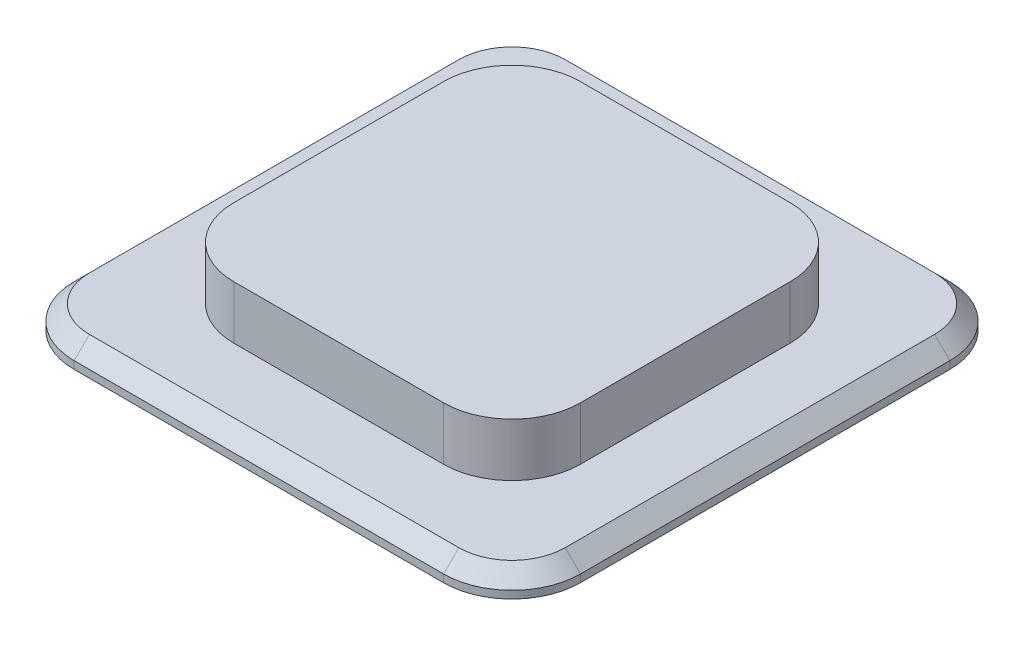
ISO-10303-21;
HEADER;
FILE_DESCRIPTION(('STEP AP214'),'2;1');
FILE_NAME('part.step','',(''),(''),'','','');
FILE_SCHEMA(('AUTOMOTIVE_DESIGN { 1 0 10303 214 1 1 1 1 }'));
ENDSEC;
DATA;
#1=APPLICATION_CONTEXT('core data for automotive mechanical design processes');
#2=APPLICATION_PROTOCOL_DEFINITION('international standard','automotive_design',2000,#1);
#3=PRODUCT_CONTEXT('',#1,'mechanical');
#4=PRODUCT('Part','Part','',(#3));
#5=PRODUCT_RELATED_PRODUCT_CATEGORY('part','',(#4));
#6=PRODUCT_DEFINITION_FORMATION('','',#4);
#7=PRODUCT_DEFINITION_CONTEXT('part definition',#1,'design');
#8=PRODUCT_DEFINITION('design','',#6,#7);
#9=PRODUCT_DEFINITION_SHAPE('','',#8);
#10=(LENGTH_UNIT() NAMED_UNIT(*) SI_UNIT(.MILLI.,.METRE.));
#11=(NAMED_UNIT(*) PLANE_ANGLE_UNIT() SI_UNIT($,.RADIAN.));
#12=(NAMED_UNIT(*) SI_UNIT($,.STERADIAN.) SOLID_ANGLE_UNIT());
#13=UNCERTAINTY_MEASURE_WITH_UNIT(LENGTH_MEASURE(1.E-05),#10,'distance_accuracy_value','');
#14=(GEOMETRIC_REPRESENTATION_CONTEXT(3) GLOBAL_UNCERTAINTY_ASSIGNED_CONTEXT((#13)) GLOBAL_UNIT_ASSIGNED_CONTEXT((#10,
#11,#12)) REPRESENTATION_CONTEXT('',''));
#15=CARTESIAN_POINT('',(0.,0.,0.));
#16=DIRECTION('',(0.,0.,1.));
#17=DIRECTION('',(1.,0.,0.));
#18=AXIS2_PLACEMENT_3D('',#15,#16,#17);
#19=CARTESIAN_POINT('',(0.,1.5,0.));
#20=DIRECTION('',(0.,1.,0.));
#21=DIRECTION('',(0.,0.,1.));
#22=AXIS2_PLACEMENT_3D('',#19,#20,#21);
#23=PLANE('',#22);
#24=DIRECTION('',(0.,0.,-1.));
#25=VECTOR('',#24,1.);
#26=CARTESIAN_POINT('',(15.65,1.5,-12.15));
#27=LINE('',#26,#25);
#28=CARTESIAN_POINT('',(15.65,1.5,12.15));
#29=VERTEX_POINT('',#28);
#30=CARTESIAN_POINT('',(15.65,1.5,-12.15));
#31=VERTEX_POINT('',#30);
#32=EDGE_CURVE('E279',#29,#31,#27,.T.);
#33=ORIENTED_EDGE('',*,*,#32,.T.);
#34=CARTESIAN_POINT('',(12.15,1.5,-12.15));
#35=DIRECTION('',(0.,1.,0.));
#36=DIRECTION('',(0.,0.,1.));
#37=AXIS2_PLACEMENT_3D('',#34,#35,#36);
#38=CIRCLE('',#37,3.49999999999999);
#39=CARTESIAN_POINT('',(12.15,1.5,-15.65));
#40=VERTEX_POINT('',#39);
#41=EDGE_CURVE('E281',#31,#40,#38,.T.);
#42=ORIENTED_EDGE('',*,*,#41,.T.);
#43=DIRECTION('',(-1.,0.,0.));
#44=VECTOR('',#43,1.);
#45=CARTESIAN_POINT('',(0.,1.5,-15.65));
#46=LINE('',#45,#44);
#47=CARTESIAN_POINT('',(-12.15,1.5,-15.65));
#48=VERTEX_POINT('',#47);
#49=EDGE_CURVE('E267',#40,#48,#46,.T.);
#50=ORIENTED_EDGE('',*,*,#49,.T.);
#51=CARTESIAN_POINT('',(-12.15,1.5,-12.15));
#52=DIRECTION('',(0.,1.,0.));
#53=DIRECTION('',(0.,0.,1.));
#54=AXIS2_PLACEMENT_3D('',#51,#52,#53);
#55=CIRCLE('',#54,3.49999999999999);
#56=CARTESIAN_POINT('',(-15.65,1.5,-12.15));
#57=VERTEX_POINT('',#56);
#58=EDGE_CURVE('E269',#48,#57,#55,.T.);
#59=ORIENTED_EDGE('',*,*,#58,.T.);
#60=DIRECTION('',(0.,0.,1.));
#61=VECTOR('',#60,1.);
#62=CARTESIAN_POINT('',(-15.65,1.5,0.));
#63=LINE('',#62,#61);
#64=CARTESIAN_POINT('',(-15.65,1.5,12.15));
#65=VERTEX_POINT('',#64);
#66=EDGE_CURVE('E271',#57,#65,#63,.T.);
#67=ORIENTED_EDGE('',*,*,#66,.T.);
#68=CARTESIAN_POINT('',(-12.15,1.5,12.15));
#69=DIRECTION('',(0.,1.,0.));
#70=DIRECTION('',(0.,0.,1.));
#71=AXIS2_PLACEMENT_3D('',#68,#69,#70);
#72=CIRCLE('',#71,3.49999999999999);
#73=CARTESIAN_POINT('',(-12.15,1.5,15.65));
#74=VERTEX_POINT('',#73);
#75=EDGE_CURVE('E273',#65,#74,#72,.T.);
#76=ORIENTED_EDGE('',*,*,#75,.T.);
#77=DIRECTION('',(1.,0.,0.));
#78=VECTOR('',#77,1.);
#79=CARTESIAN_POINT('',(12.15,1.5,15.65));
#80=LINE('',#79,#78);
#81=CARTESIAN_POINT('',(12.15,1.5,15.65));
#82=VERTEX_POINT('',#81);
#83=EDGE_CURVE('E275',#74,#82,#80,.T.);
#84=ORIENTED_EDGE('',*,*,#83,.T.);
#85=CARTESIAN_POINT('',(12.15,1.5,12.15));
#86=DIRECTION('',(0.,1.,0.));
#87=DIRECTION('',(0.,0.,1.));
#88=AXIS2_PLACEMENT_3D('',#85,#86,#87);
#89=CIRCLE('',#88,3.49999999999999);
#90=EDGE_CURVE('E277',#82,#29,#89,.T.);
#91=ORIENTED_EDGE('',*,*,#90,.T.);
#92=EDGE_LOOP('',(#33,#42,#50,#59,#67,#76,#84,#91));
#93=FACE_BOUND('',#92,.T.);
#94=DIRECTION('',(-1.,0.,0.));
#95=VECTOR('',#94,1.);
#96=CARTESIAN_POINT('',(0.,1.5,-11.4));
#97=LINE('',#96,#95);
#98=CARTESIAN_POINT('',(6.9,1.5,-11.4));
#99=VERTEX_POINT('',#98);
#100=CARTESIAN_POINT('',(-6.9,1.5,-11.4));
#101=VERTEX_POINT('',#100);
#102=EDGE_CURVE('E340',#99,#101,#97,.T.);
#103=ORIENTED_EDGE('',*,*,#102,.F.);
#104=CARTESIAN_POINT('',(6.9,1.5,-6.9));
#105=DIRECTION('',(0.,1.,0.));
#106=DIRECTION('',(0.,0.,1.));
#107=AXIS2_PLACEMENT_3D('',#104,#105,#106);
#108=CIRCLE('',#107,4.5);
#109=CARTESIAN_POINT('',(11.4,1.5,-6.9));
#110=VERTEX_POINT('',#109);
#111=EDGE_CURVE('E261',#99,#110,#108,.F.);
#112=ORIENTED_EDGE('',*,*,#111,.T.);
#113=DIRECTION('',(0.,0.,1.));
#114=VECTOR('',#113,1.);
#115=CARTESIAN_POINT('',(11.4,1.5,0.));
#116=LINE('',#115,#114);
#117=CARTESIAN_POINT('',(11.4,1.5,6.9));
#118=VERTEX_POINT('',#117);
#119=EDGE_CURVE('E343',#110,#118,#116,.T.);
#120=ORIENTED_EDGE('',*,*,#119,.T.);
#121=CARTESIAN_POINT('',(6.9,1.5,6.9));
#122=DIRECTION('',(0.,1.,0.));
#123=DIRECTION('',(0.,0.,1.));
#124=AXIS2_PLACEMENT_3D('',#121,#122,#123);
#125=CIRCLE('',#124,4.5);
#126=CARTESIAN_POINT('',(6.9,1.5,11.4));
#127=VERTEX_POINT('',#126);
#128=EDGE_CURVE('E259',#118,#127,#125,.F.);
#129=ORIENTED_EDGE('',*,*,#128,.T.);
#130=DIRECTION('',(-1.,0.,0.));
#131=VECTOR('',#130,1.);
#132=CARTESIAN_POINT('',(0.,1.5,11.4));
#133=LINE('',#132,#131);
#134=CARTESIAN_POINT('',(-6.9,1.5,11.4));
#135=VERTEX_POINT('',#134);
#136=EDGE_CURVE('E210',#127,#135,#133,.T.);
#137=ORIENTED_EDGE('',*,*,#136,.T.);
#138=CARTESIAN_POINT('',(-6.9,1.5,6.9));
#139=DIRECTION('',(0.,1.,0.));
#140=DIRECTION('',(0.,0.,1.));
#141=AXIS2_PLACEMENT_3D('',#138,#139,#140);
#142=CIRCLE('',#141,4.5);
#143=CARTESIAN_POINT('',(-11.4,1.5,6.9));
#144=VERTEX_POINT('',#143);
#145=EDGE_CURVE('E265',#135,#144,#142,.F.);
#146=ORIENTED_EDGE('',*,*,#145,.T.);
#147=DIRECTION('',(0.,0.,1.));
#148=VECTOR('',#147,1.);
#149=CARTESIAN_POINT('',(-11.4,1.5,0.));
#150=LINE('',#149,#148);
#151=CARTESIAN_POINT('',(-11.4,1.5,-6.9));
#152=VERTEX_POINT('',#151);
#153=EDGE_CURVE('E337',#152,#144,#150,.T.);
#154=ORIENTED_EDGE('',*,*,#153,.F.);
#155=CARTESIAN_POINT('',(-6.9,1.5,-6.9));
#156=DIRECTION('',(0.,1.,0.));
#157=DIRECTION('',(0.,0.,1.));
#158=AXIS2_PLACEMENT_3D('',#155,#156,#157);
#159=CIRCLE('',#158,4.5);
#160=EDGE_CURVE('E263',#152,#101,#159,.F.);
#161=ORIENTED_EDGE('',*,*,#160,.T.);
#162=EDGE_LOOP('',(#103,#112,#120,#129,#137,#146,#154,#161));
#163=FACE_BOUND('',#162,.T.);
#164=ADVANCED_FACE('F37',(#93,#163),#23,.T.);
#165=CARTESIAN_POINT('',(0.,1.5,16.65));
#166=DIRECTION('',(0.,0.,-1.));
#167=DIRECTION('',(-1.,0.,0.));
#168=AXIS2_PLACEMENT_3D('',#165,#166,#167);
#169=PLANE('',#168);
#170=DIRECTION('',(0.,-1.,0.));
#171=VECTOR('',#170,1.);
#172=CARTESIAN_POINT('',(12.15,1.5,16.65));
#173=LINE('',#172,#171);
#174=CARTESIAN_POINT('',(12.15,0.,16.65));
#175=VERTEX_POINT('',#174);
#176=CARTESIAN_POINT('',(12.15,0.499999999999992,16.65));
#177=VERTEX_POINT('',#176);
#178=EDGE_CURVE('E195',#175,#177,#173,.F.);
#179=ORIENTED_EDGE('',*,*,#178,.T.);
#180=DIRECTION('',(-1.,0.,0.));
#181=VECTOR('',#180,1.);
#182=CARTESIAN_POINT('',(-12.15,0.499999999999992,16.65));
#183=LINE('',#182,#181);
#184=CARTESIAN_POINT('',(-12.15,0.499999999999992,16.65));
#185=VERTEX_POINT('',#184);
#186=EDGE_CURVE('E290',#177,#185,#183,.T.);
#187=ORIENTED_EDGE('',*,*,#186,.T.);
#188=DIRECTION('',(0.,-1.,0.));
#189=VECTOR('',#188,1.);
#190=CARTESIAN_POINT('',(-12.15,0.,16.65));
#191=LINE('',#190,#189);
#192=CARTESIAN_POINT('',(-12.15,0.,16.65));
#193=VERTEX_POINT('',#192);
#194=EDGE_CURVE('E199',#185,#193,#191,.T.);
#195=ORIENTED_EDGE('',*,*,#194,.T.);
#196=DIRECTION('',(1.,0.,0.));
#197=VECTOR('',#196,1.);
#198=CARTESIAN_POINT('',(0.,0.,16.65));
#199=LINE('',#198,#197);
#200=EDGE_CURVE('E206',#193,#175,#199,.T.);
#201=ORIENTED_EDGE('',*,*,#200,.T.);
#202=EDGE_LOOP('',(#179,#187,#195,#201));
#203=FACE_BOUND('',#202,.T.);
#204=ADVANCED_FACE('F394',(#203),#169,.F.);
#205=CARTESIAN_POINT('',(16.65,1.5,0.));
#206=DIRECTION('',(-1.,0.,0.));
#207=DIRECTION('',(0.,0.,1.));
#208=AXIS2_PLACEMENT_3D('',#205,#206,#207);
#209=PLANE('',#208);
#210=DIRECTION('',(0.,-1.,0.));
#211=VECTOR('',#210,1.);
#212=CARTESIAN_POINT('',(16.65,1.5,-12.15));
#213=LINE('',#212,#211);
#214=CARTESIAN_POINT('',(16.65,0.,-12.15));
#215=VERTEX_POINT('',#214);
#216=CARTESIAN_POINT('',(16.65,0.499999999999992,-12.15));
#217=VERTEX_POINT('',#216);
#218=EDGE_CURVE('E189',#215,#217,#213,.F.);
#219=ORIENTED_EDGE('',*,*,#218,.T.);
#220=DIRECTION('',(0.,0.,1.));
#221=VECTOR('',#220,1.);
#222=CARTESIAN_POINT('',(16.65,0.499999999999992,12.15));
#223=LINE('',#222,#221);
#224=CARTESIAN_POINT('',(16.65,0.499999999999992,12.15));
#225=VERTEX_POINT('',#224);
#226=EDGE_CURVE('E185',#217,#225,#223,.T.);
#227=ORIENTED_EDGE('',*,*,#226,.T.);
#228=DIRECTION('',(0.,-1.,0.));
#229=VECTOR('',#228,1.);
#230=CARTESIAN_POINT('',(16.65,1.5,12.15));
#231=LINE('',#230,#229);
#232=CARTESIAN_POINT('',(16.65,0.,12.15));
#233=VERTEX_POINT('',#232);
#234=EDGE_CURVE('E177',#225,#233,#231,.T.);
#235=ORIENTED_EDGE('',*,*,#234,.T.);
#236=DIRECTION('',(0.,0.,-1.));
#237=VECTOR('',#236,1.);
#238=CARTESIAN_POINT('',(16.65,0.,0.));
#239=LINE('',#238,#237);
#240=EDGE_CURVE('E182',#233,#215,#239,.T.);
#241=ORIENTED_EDGE('',*,*,#240,.T.);
#242=EDGE_LOOP('',(#219,#227,#235,#241));
#243=FACE_BOUND('',#242,.T.);
#244=ADVANCED_FACE('F180',(#243),#209,.F.);
#245=CARTESIAN_POINT('',(0.,1.5,-16.65));
#246=DIRECTION('',(0.,0.,-1.));
#247=DIRECTION('',(-1.,0.,0.));
#248=AXIS2_PLACEMENT_3D('',#245,#246,#247);
#249=PLANE('',#248);
#250=DIRECTION('',(0.,-1.,0.));
#251=VECTOR('',#250,1.);
#252=CARTESIAN_POINT('',(-12.15,1.5,-16.65));
#253=LINE('',#252,#251);
#254=CARTESIAN_POINT('',(-12.15,0.,-16.65));
#255=VERTEX_POINT('',#254);
#256=CARTESIAN_POINT('',(-12.15,0.499999999999992,-16.65));
#257=VERTEX_POINT('',#256);
#258=EDGE_CURVE('E246',#255,#257,#253,.F.);
#259=ORIENTED_EDGE('',*,*,#258,.T.);
#260=DIRECTION('',(1.,0.,0.));
#261=VECTOR('',#260,1.);
#262=CARTESIAN_POINT('',(0.,0.499999999999992,-16.65));
#263=LINE('',#262,#261);
#264=CARTESIAN_POINT('',(12.15,0.499999999999992,-16.65));
#265=VERTEX_POINT('',#264);
#266=EDGE_CURVE('E11',#257,#265,#263,.T.);
#267=ORIENTED_EDGE('',*,*,#266,.T.);
#268=DIRECTION('',(0.,-1.,0.));
#269=VECTOR('',#268,1.);
#270=CARTESIAN_POINT('',(12.15,0.,-16.65));
#271=LINE('',#270,#269);
#272=CARTESIAN_POINT('',(12.15,0.,-16.65));
#273=VERTEX_POINT('',#272);
#274=EDGE_CURVE('E248',#265,#273,#271,.T.);
#275=ORIENTED_EDGE('',*,*,#274,.T.);
#276=DIRECTION('',(1.,0.,0.));
#277=VECTOR('',#276,1.);
#278=CARTESIAN_POINT('',(0.,0.,-16.65));
#279=LINE('',#278,#277);
#280=EDGE_CURVE('E205',#255,#273,#279,.T.);
#281=ORIENTED_EDGE('',*,*,#280,.F.);
#282=EDGE_LOOP('',(#259,#267,#275,#281));
#283=FACE_BOUND('',#282,.T.);
#284=ADVANCED_FACE('F410',(#283),#249,.T.);
#285=CARTESIAN_POINT('',(-16.65,1.5,0.));
#286=DIRECTION('',(-1.,0.,0.));
#287=DIRECTION('',(0.,0.,1.));
#288=AXIS2_PLACEMENT_3D('',#285,#286,#287);
#289=PLANE('',#288);
#290=DIRECTION('',(0.,-1.,0.));
#291=VECTOR('',#290,1.);
#292=CARTESIAN_POINT('',(-16.65,1.5,12.15));
#293=LINE('',#292,#291);
#294=CARTESIAN_POINT('',(-16.65,0.,12.15));
#295=VERTEX_POINT('',#294);
#296=CARTESIAN_POINT('',(-16.65,0.499999999999992,12.15));
#297=VERTEX_POINT('',#296);
#298=EDGE_CURVE('E250',#295,#297,#293,.F.);
#299=ORIENTED_EDGE('',*,*,#298,.T.);
#300=DIRECTION('',(0.,0.,-1.));
#301=VECTOR('',#300,1.);
#302=CARTESIAN_POINT('',(-16.65,0.499999999999992,0.));
#303=LINE('',#302,#301);
#304=CARTESIAN_POINT('',(-16.65,0.499999999999992,-12.15));
#305=VERTEX_POINT('',#304);
#306=EDGE_CURVE('E62',#297,#305,#303,.T.);
#307=ORIENTED_EDGE('',*,*,#306,.T.);
#308=DIRECTION('',(0.,-1.,0.));
#309=VECTOR('',#308,1.);
#310=CARTESIAN_POINT('',(-16.65,1.5,-12.15));
#311=LINE('',#310,#309);
#312=CARTESIAN_POINT('',(-16.65,0.,-12.15));
#313=VERTEX_POINT('',#312);
#314=EDGE_CURVE('E252',#305,#313,#311,.T.);
#315=ORIENTED_EDGE('',*,*,#314,.T.);
#316=DIRECTION('',(0.,0.,-1.));
#317=VECTOR('',#316,1.);
#318=CARTESIAN_POINT('',(-16.65,0.,0.));
#319=LINE('',#318,#317);
#320=EDGE_CURVE('E208',#295,#313,#319,.T.);
#321=ORIENTED_EDGE('',*,*,#320,.F.);
#322=EDGE_LOOP('',(#299,#307,#315,#321));
#323=FACE_BOUND('',#322,.T.);
#324=ADVANCED_FACE('F407',(#323),#289,.T.);
#325=CARTESIAN_POINT('',(0.,0.,0.));
#326=DIRECTION('',(0.,1.,0.));
#327=DIRECTION('',(0.,0.,1.));
#328=AXIS2_PLACEMENT_3D('',#325,#326,#327);
#329=PLANE('',#328);
#330=ORIENTED_EDGE('',*,*,#240,.F.);
#331=CARTESIAN_POINT('',(12.15,0.,12.15));
#332=DIRECTION('',(0.,1.,0.));
#333=DIRECTION('',(0.,0.,1.));
#334=AXIS2_PLACEMENT_3D('',#331,#332,#333);
#335=CIRCLE('',#334,4.5);
#336=EDGE_CURVE('E192',#233,#175,#335,.F.);
#337=ORIENTED_EDGE('',*,*,#336,.T.);
#338=ORIENTED_EDGE('',*,*,#200,.F.);
#339=CARTESIAN_POINT('',(-12.15,0.,12.15));
#340=DIRECTION('',(0.,1.,0.));
#341=DIRECTION('',(0.,0.,1.));
#342=AXIS2_PLACEMENT_3D('',#339,#340,#341);
#343=CIRCLE('',#342,4.5);
#344=EDGE_CURVE('E188',#193,#295,#343,.F.);
#345=ORIENTED_EDGE('',*,*,#344,.T.);
#346=ORIENTED_EDGE('',*,*,#320,.T.);
#347=CARTESIAN_POINT('',(-12.15,0.,-12.15));
#348=DIRECTION('',(0.,1.,0.));
#349=DIRECTION('',(0.,0.,1.));
#350=AXIS2_PLACEMENT_3D('',#347,#348,#349);
#351=CIRCLE('',#350,4.5);
#352=EDGE_CURVE('E218',#313,#255,#351,.F.);
#353=ORIENTED_EDGE('',*,*,#352,.T.);
#354=ORIENTED_EDGE('',*,*,#280,.T.);
#355=CARTESIAN_POINT('',(12.15,0.,-12.15));
#356=DIRECTION('',(0.,1.,0.));
#357=DIRECTION('',(0.,0.,1.));
#358=AXIS2_PLACEMENT_3D('',#355,#356,#357);
#359=CIRCLE('',#358,4.5);
#360=EDGE_CURVE('E200',#273,#215,#359,.F.);
#361=ORIENTED_EDGE('',*,*,#360,.T.);
#362=EDGE_LOOP('',(#330,#337,#338,#345,#346,#353,#354,#361));
#363=FACE_BOUND('',#362,.T.);
#364=ADVANCED_FACE('F202',(#363),#329,.F.);
#365=CARTESIAN_POINT('',(0.,5.,11.4));
#366=DIRECTION('',(0.,0.,-1.));
#367=DIRECTION('',(-1.,0.,0.));
#368=AXIS2_PLACEMENT_3D('',#365,#366,#367);
#369=PLANE('',#368);
#370=ORIENTED_EDGE('',*,*,#136,.F.);
#371=DIRECTION('',(0.,-1.,0.));
#372=VECTOR('',#371,1.);
#373=CARTESIAN_POINT('',(6.9,5.,11.4));
#374=LINE('',#373,#372);
#375=CARTESIAN_POINT('',(6.9,5.,11.4));
#376=VERTEX_POINT('',#375);
#377=EDGE_CURVE('E231',#127,#376,#374,.F.);
#378=ORIENTED_EDGE('',*,*,#377,.T.);
#379=DIRECTION('',(1.,0.,0.));
#380=VECTOR('',#379,1.);
#381=CARTESIAN_POINT('',(0.,5.,11.4));
#382=LINE('',#381,#380);
#383=CARTESIAN_POINT('',(-6.9,5.,11.4));
#384=VERTEX_POINT('',#383);
#385=EDGE_CURVE('E317',#384,#376,#382,.T.);
#386=ORIENTED_EDGE('',*,*,#385,.F.);
#387=DIRECTION('',(0.,-1.,0.));
#388=VECTOR('',#387,1.);
#389=CARTESIAN_POINT('',(-6.9,1.5,11.4));
#390=LINE('',#389,#388);
#391=EDGE_CURVE('E228',#384,#135,#390,.T.);
#392=ORIENTED_EDGE('',*,*,#391,.T.);
#393=EDGE_LOOP('',(#370,#378,#386,#392));
#394=FACE_BOUND('',#393,.T.);
#395=ADVANCED_FACE('F352',(#394),#369,.F.);
#396=CARTESIAN_POINT('',(11.4,5.,0.));
#397=DIRECTION('',(-1.,0.,0.));
#398=DIRECTION('',(0.,0.,1.));
#399=AXIS2_PLACEMENT_3D('',#396,#397,#398);
#400=PLANE('',#399);
#401=DIRECTION('',(0.,0.,-1.));
#402=VECTOR('',#401,1.);
#403=CARTESIAN_POINT('',(11.4,5.,0.));
#404=LINE('',#403,#402);
#405=CARTESIAN_POINT('',(11.4,5.,6.9));
#406=VERTEX_POINT('',#405);
#407=CARTESIAN_POINT('',(11.4,5.,-6.9));
#408=VERTEX_POINT('',#407);
#409=EDGE_CURVE('E323',#406,#408,#404,.T.);
#410=ORIENTED_EDGE('',*,*,#409,.F.);
#411=DIRECTION('',(0.,-1.,0.));
#412=VECTOR('',#411,1.);
#413=CARTESIAN_POINT('',(11.4,5.,6.9));
#414=LINE('',#413,#412);
#415=EDGE_CURVE('E225',#406,#118,#414,.T.);
#416=ORIENTED_EDGE('',*,*,#415,.T.);
#417=ORIENTED_EDGE('',*,*,#119,.F.);
#418=DIRECTION('',(0.,-1.,0.));
#419=VECTOR('',#418,1.);
#420=CARTESIAN_POINT('',(11.4,5.,-6.9));
#421=LINE('',#420,#419);
#422=EDGE_CURVE('E223',#110,#408,#421,.F.);
#423=ORIENTED_EDGE('',*,*,#422,.T.);
#424=EDGE_LOOP('',(#410,#416,#417,#423));
#425=FACE_BOUND('',#424,.T.);
#426=ADVANCED_FACE('F361',(#425),#400,.F.);
#427=CARTESIAN_POINT('',(0.,5.,-11.4));
#428=DIRECTION('',(0.,0.,-1.));
#429=DIRECTION('',(-1.,0.,0.));
#430=AXIS2_PLACEMENT_3D('',#427,#428,#429);
#431=PLANE('',#430);
#432=DIRECTION('',(1.,0.,0.));
#433=VECTOR('',#432,1.);
#434=CARTESIAN_POINT('',(0.,5.,-11.4));
#435=LINE('',#434,#433);
#436=CARTESIAN_POINT('',(-6.9,5.,-11.4));
#437=VERTEX_POINT('',#436);
#438=CARTESIAN_POINT('',(6.9,5.,-11.4));
#439=VERTEX_POINT('',#438);
#440=EDGE_CURVE('E329',#437,#439,#435,.T.);
#441=ORIENTED_EDGE('',*,*,#440,.T.);
#442=DIRECTION('',(0.,-1.,0.));
#443=VECTOR('',#442,1.);
#444=CARTESIAN_POINT('',(6.9,1.5,-11.4));
#445=LINE('',#444,#443);
#446=EDGE_CURVE('E243',#439,#99,#445,.T.);
#447=ORIENTED_EDGE('',*,*,#446,.T.);
#448=ORIENTED_EDGE('',*,*,#102,.T.);
#449=DIRECTION('',(0.,-1.,0.));
#450=VECTOR('',#449,1.);
#451=CARTESIAN_POINT('',(-6.9,5.,-11.4));
#452=LINE('',#451,#450);
#453=EDGE_CURVE('E241',#101,#437,#452,.F.);
#454=ORIENTED_EDGE('',*,*,#453,.T.);
#455=EDGE_LOOP('',(#441,#447,#448,#454));
#456=FACE_BOUND('',#455,.T.);
#457=ADVANCED_FACE('F370',(#456),#431,.T.);
#458=CARTESIAN_POINT('',(-11.4,5.,0.));
#459=DIRECTION('',(-1.,0.,0.));
#460=DIRECTION('',(0.,0.,1.));
#461=AXIS2_PLACEMENT_3D('',#458,#459,#460);
#462=PLANE('',#461);
#463=DIRECTION('',(0.,0.,-1.));
#464=VECTOR('',#463,1.);
#465=CARTESIAN_POINT('',(-11.4,5.,0.));
#466=LINE('',#465,#464);
#467=CARTESIAN_POINT('',(-11.4,5.,6.9));
#468=VERTEX_POINT('',#467);
#469=CARTESIAN_POINT('',(-11.4,5.,-6.9));
#470=VERTEX_POINT('',#469);
#471=EDGE_CURVE('E334',#468,#470,#466,.T.);
#472=ORIENTED_EDGE('',*,*,#471,.T.);
#473=DIRECTION('',(0.,-1.,0.));
#474=VECTOR('',#473,1.);
#475=CARTESIAN_POINT('',(-11.4,5.,-6.9));
#476=LINE('',#475,#474);
#477=EDGE_CURVE('E256',#470,#152,#476,.T.);
#478=ORIENTED_EDGE('',*,*,#477,.T.);
#479=ORIENTED_EDGE('',*,*,#153,.T.);
#480=DIRECTION('',(0.,-1.,0.));
#481=VECTOR('',#480,1.);
#482=CARTESIAN_POINT('',(-11.4,5.,6.9));
#483=LINE('',#482,#481);
#484=EDGE_CURVE('E254',#144,#468,#483,.F.);
#485=ORIENTED_EDGE('',*,*,#484,.T.);
#486=EDGE_LOOP('',(#472,#478,#479,#485));
#487=FACE_BOUND('',#486,.T.);
#488=ADVANCED_FACE('F378',(#487),#462,.T.);
#489=CARTESIAN_POINT('',(0.,5.,0.));
#490=DIRECTION('',(0.,1.,0.));
#491=DIRECTION('',(0.,0.,1.));
#492=AXIS2_PLACEMENT_3D('',#489,#490,#491);
#493=PLANE('',#492);
#494=ORIENTED_EDGE('',*,*,#385,.T.);
#495=CARTESIAN_POINT('',(6.9,5.,6.9));
#496=DIRECTION('',(0.,1.,0.));
#497=DIRECTION('',(0.,0.,1.));
#498=AXIS2_PLACEMENT_3D('',#495,#496,#497);
#499=CIRCLE('',#498,4.5);
#500=EDGE_CURVE('E239',#376,#406,#499,.T.);
#501=ORIENTED_EDGE('',*,*,#500,.T.);
#502=ORIENTED_EDGE('',*,*,#409,.T.);
#503=CARTESIAN_POINT('',(6.9,5.,-6.9));
#504=DIRECTION('',(0.,1.,0.));
#505=DIRECTION('',(0.,0.,1.));
#506=AXIS2_PLACEMENT_3D('',#503,#504,#505);
#507=CIRCLE('',#506,4.5);
#508=EDGE_CURVE('E237',#408,#439,#507,.T.);
#509=ORIENTED_EDGE('',*,*,#508,.T.);
#510=ORIENTED_EDGE('',*,*,#440,.F.);
#511=CARTESIAN_POINT('',(-6.9,5.,-6.9));
#512=DIRECTION('',(0.,1.,0.));
#513=DIRECTION('',(0.,0.,1.));
#514=AXIS2_PLACEMENT_3D('',#511,#512,#513);
#515=CIRCLE('',#514,4.5);
#516=EDGE_CURVE('E235',#437,#470,#515,.T.);
#517=ORIENTED_EDGE('',*,*,#516,.T.);
#518=ORIENTED_EDGE('',*,*,#471,.F.);
#519=CARTESIAN_POINT('',(-6.9,5.,6.9));
#520=DIRECTION('',(0.,1.,0.));
#521=DIRECTION('',(0.,0.,1.));
#522=AXIS2_PLACEMENT_3D('',#519,#520,#521);
#523=CIRCLE('',#522,4.5);
#524=EDGE_CURVE('E233',#468,#384,#523,.T.);
#525=ORIENTED_EDGE('',*,*,#524,.T.);
#526=EDGE_LOOP('',(#494,#501,#502,#509,#510,#517,#518,#525));
#527=FACE_BOUND('',#526,.T.);
#528=ADVANCED_FACE('F358',(#527),#493,.T.);
#529=CARTESIAN_POINT('',(12.15,1.5,12.15));
#530=DIRECTION('',(0.,-1.,0.));
#531=DIRECTION('',(0.,0.,-1.));
#532=AXIS2_PLACEMENT_3D('',#529,#530,#531);
#533=CYLINDRICAL_SURFACE('',#532,4.5);
#534=ORIENTED_EDGE('',*,*,#234,.F.);
#535=CARTESIAN_POINT('',(12.15,0.499999999999992,12.15));
#536=DIRECTION('',(0.,1.,0.));
#537=DIRECTION('',(0.,0.,1.));
#538=AXIS2_PLACEMENT_3D('',#535,#536,#537);
#539=CIRCLE('',#538,4.5);
#540=EDGE_CURVE('E288',#225,#177,#539,.F.);
#541=ORIENTED_EDGE('',*,*,#540,.T.);
#542=ORIENTED_EDGE('',*,*,#178,.F.);
#543=ORIENTED_EDGE('',*,*,#336,.F.);
#544=EDGE_LOOP('',(#534,#541,#542,#543));
#545=FACE_BOUND('',#544,.T.);
#546=ADVANCED_FACE('F193',(#545),#533,.T.);
#547=CARTESIAN_POINT('',(6.9,5.,6.9));
#548=DIRECTION('',(0.,-1.,0.));
#549=DIRECTION('',(0.,0.,-1.));
#550=AXIS2_PLACEMENT_3D('',#547,#548,#549);
#551=CYLINDRICAL_SURFACE('',#550,4.5);
#552=ORIENTED_EDGE('',*,*,#500,.F.);
#553=ORIENTED_EDGE('',*,*,#377,.F.);
#554=ORIENTED_EDGE('',*,*,#128,.F.);
#555=ORIENTED_EDGE('',*,*,#415,.F.);
#556=EDGE_LOOP('',(#552,#553,#554,#555));
#557=FACE_BOUND('',#556,.T.);
#558=ADVANCED_FACE('F355',(#557),#551,.T.);
#559=CARTESIAN_POINT('',(6.9,5.,-6.9));
#560=DIRECTION('',(0.,1.,0.));
#561=DIRECTION('',(0.,0.,1.));
#562=AXIS2_PLACEMENT_3D('',#559,#560,#561);
#563=CYLINDRICAL_SURFACE('',#562,4.5);
#564=ORIENTED_EDGE('',*,*,#508,.F.);
#565=ORIENTED_EDGE('',*,*,#422,.F.);
#566=ORIENTED_EDGE('',*,*,#111,.F.);
#567=ORIENTED_EDGE('',*,*,#446,.F.);
#568=EDGE_LOOP('',(#564,#565,#566,#567));
#569=FACE_BOUND('',#568,.T.);
#570=ADVANCED_FACE('F365',(#569),#563,.T.);
#571=CARTESIAN_POINT('',(12.15,1.5,-12.15));
#572=DIRECTION('',(0.,1.,0.));
#573=DIRECTION('',(0.,0.,1.));
#574=AXIS2_PLACEMENT_3D('',#571,#572,#573);
#575=CYLINDRICAL_SURFACE('',#574,4.5);
#576=ORIENTED_EDGE('',*,*,#274,.F.);
#577=CARTESIAN_POINT('',(12.15,0.499999999999992,-12.15));
#578=DIRECTION('',(0.,1.,0.));
#579=DIRECTION('',(0.,0.,1.));
#580=AXIS2_PLACEMENT_3D('',#577,#578,#579);
#581=CIRCLE('',#580,4.5);
#582=EDGE_CURVE('E284',#265,#217,#581,.F.);
#583=ORIENTED_EDGE('',*,*,#582,.T.);
#584=ORIENTED_EDGE('',*,*,#218,.F.);
#585=ORIENTED_EDGE('',*,*,#360,.F.);
#586=EDGE_LOOP('',(#576,#583,#584,#585));
#587=FACE_BOUND('',#586,.T.);
#588=ADVANCED_FACE('F422',(#587),#575,.T.);
#589=CARTESIAN_POINT('',(-12.15,1.5,-12.15));
#590=DIRECTION('',(0.,-1.,0.));
#591=DIRECTION('',(0.,0.,-1.));
#592=AXIS2_PLACEMENT_3D('',#589,#590,#591);
#593=CYLINDRICAL_SURFACE('',#592,4.5);
#594=ORIENTED_EDGE('',*,*,#314,.F.);
#595=CARTESIAN_POINT('',(-12.15,0.499999999999992,-12.15));
#596=DIRECTION('',(0.,1.,0.));
#597=DIRECTION('',(0.,0.,1.));
#598=AXIS2_PLACEMENT_3D('',#595,#596,#597);
#599=CIRCLE('',#598,4.5);
#600=EDGE_CURVE('E47',#305,#257,#599,.F.);
#601=ORIENTED_EDGE('',*,*,#600,.T.);
#602=ORIENTED_EDGE('',*,*,#258,.F.);
#603=ORIENTED_EDGE('',*,*,#352,.F.);
#604=EDGE_LOOP('',(#594,#601,#602,#603));
#605=FACE_BOUND('',#604,.T.);
#606=ADVANCED_FACE('F391',(#605),#593,.T.);
#607=CARTESIAN_POINT('',(-6.9,5.,-6.9));
#608=DIRECTION('',(0.,-1.,0.));
#609=DIRECTION('',(0.,0.,-1.));
#610=AXIS2_PLACEMENT_3D('',#607,#608,#609);
#611=CYLINDRICAL_SURFACE('',#610,4.5);
#612=ORIENTED_EDGE('',*,*,#516,.F.);
#613=ORIENTED_EDGE('',*,*,#453,.F.);
#614=ORIENTED_EDGE('',*,*,#160,.F.);
#615=ORIENTED_EDGE('',*,*,#477,.F.);
#616=EDGE_LOOP('',(#612,#613,#614,#615));
#617=FACE_BOUND('',#616,.T.);
#618=ADVANCED_FACE('F373',(#617),#611,.T.);
#619=CARTESIAN_POINT('',(-6.9,5.,6.9));
#620=DIRECTION('',(0.,1.,0.));
#621=DIRECTION('',(0.,0.,1.));
#622=AXIS2_PLACEMENT_3D('',#619,#620,#621);
#623=CYLINDRICAL_SURFACE('',#622,4.5);
#624=ORIENTED_EDGE('',*,*,#524,.F.);
#625=ORIENTED_EDGE('',*,*,#484,.F.);
#626=ORIENTED_EDGE('',*,*,#145,.F.);
#627=ORIENTED_EDGE('',*,*,#391,.F.);
#628=EDGE_LOOP('',(#624,#625,#626,#627));
#629=FACE_BOUND('',#628,.T.);
#630=ADVANCED_FACE('F381',(#629),#623,.T.);
#631=CARTESIAN_POINT('',(-12.15,1.5,12.15));
#632=DIRECTION('',(0.,1.,0.));
#633=DIRECTION('',(0.,0.,1.));
#634=AXIS2_PLACEMENT_3D('',#631,#632,#633);
#635=CYLINDRICAL_SURFACE('',#634,4.5);
#636=ORIENTED_EDGE('',*,*,#194,.F.);
#637=CARTESIAN_POINT('',(-12.15,0.499999999999992,12.15));
#638=DIRECTION('',(0.,1.,0.));
#639=DIRECTION('',(0.,0.,1.));
#640=AXIS2_PLACEMENT_3D('',#637,#638,#639);
#641=CIRCLE('',#640,4.5);
#642=EDGE_CURVE('E292',#185,#297,#641,.F.);
#643=ORIENTED_EDGE('',*,*,#642,.T.);
#644=ORIENTED_EDGE('',*,*,#298,.F.);
#645=ORIENTED_EDGE('',*,*,#344,.F.);
#646=EDGE_LOOP('',(#636,#643,#644,#645));
#647=FACE_BOUND('',#646,.T.);
#648=ADVANCED_FACE('F383',(#647),#635,.T.);
#649=CARTESIAN_POINT('',(-12.15,1.5,12.15));
#650=DIRECTION('',(0.,-1.,0.));
#651=DIRECTION('',(0.,0.,-1.));
#652=AXIS2_PLACEMENT_3D('',#649,#650,#651);
#653=CONICAL_SURFACE('',#652,3.49999999999999,0.785398163397451);
#654=DIRECTION('',(0.70710678118655,0.707106781186545,0.));
#655=VECTOR('',#654,1.);
#656=CARTESIAN_POINT('',(-16.65,0.499999999999992,12.15));
#657=LINE('',#656,#655);
#658=EDGE_CURVE('E311',#297,#65,#657,.T.);
#659=ORIENTED_EDGE('',*,*,#658,.F.);
#660=ORIENTED_EDGE('',*,*,#642,.F.);
#661=DIRECTION('',(0.,-0.707106781186545,0.70710678118655));
#662=VECTOR('',#661,1.);
#663=CARTESIAN_POINT('',(-12.15,1.5,15.65));
#664=LINE('',#663,#662);
#665=EDGE_CURVE('E42',#74,#185,#664,.T.);
#666=ORIENTED_EDGE('',*,*,#665,.F.);
#667=ORIENTED_EDGE('',*,*,#75,.F.);
#668=EDGE_LOOP('',(#659,#660,#666,#667));
#669=FACE_BOUND('',#668,.T.);
#670=ADVANCED_FACE('F40',(#669),#653,.T.);
#671=CARTESIAN_POINT('',(0.,1.5,15.65));
#672=DIRECTION('',(0.,0.70710678118655,0.707106781186545));
#673=DIRECTION('',(-1.,0.,0.));
#674=AXIS2_PLACEMENT_3D('',#671,#672,#673);
#675=PLANE('',#674);
#676=ORIENTED_EDGE('',*,*,#665,.T.);
#677=ORIENTED_EDGE('',*,*,#186,.F.);
#678=DIRECTION('',(0.,-0.707106781186545,0.70710678118655));
#679=VECTOR('',#678,1.);
#680=CARTESIAN_POINT('',(12.15,1.5,15.65));
#681=LINE('',#680,#679);
#682=EDGE_CURVE('E309',#82,#177,#681,.T.);
#683=ORIENTED_EDGE('',*,*,#682,.F.);
#684=ORIENTED_EDGE('',*,*,#83,.F.);
#685=EDGE_LOOP('',(#676,#677,#683,#684));
#686=FACE_BOUND('',#685,.T.);
#687=ADVANCED_FACE('F458',(#686),#675,.T.);
#688=CARTESIAN_POINT('',(-16.65,0.499999999999992,0.));
#689=DIRECTION('',(0.707106781186545,-0.70710678118655,0.));
#690=DIRECTION('',(0.,0.,-1.));
#691=AXIS2_PLACEMENT_3D('',#688,#689,#690);
#692=PLANE('',#691);
#693=ORIENTED_EDGE('',*,*,#658,.T.);
#694=ORIENTED_EDGE('',*,*,#66,.F.);
#695=DIRECTION('',(0.70710678118655,0.707106781186545,0.));
#696=VECTOR('',#695,1.);
#697=CARTESIAN_POINT('',(-16.65,0.499999999999992,-12.15));
#698=LINE('',#697,#696);
#699=EDGE_CURVE('E306',#305,#57,#698,.T.);
#700=ORIENTED_EDGE('',*,*,#699,.F.);
#701=ORIENTED_EDGE('',*,*,#306,.F.);
#702=EDGE_LOOP('',(#693,#694,#700,#701));
#703=FACE_BOUND('',#702,.T.);
#704=ADVANCED_FACE('F432',(#703),#692,.F.);
#705=CARTESIAN_POINT('',(12.15,1.5,12.15));
#706=DIRECTION('',(0.,-1.,0.));
#707=DIRECTION('',(0.,0.,-1.));
#708=AXIS2_PLACEMENT_3D('',#705,#706,#707);
#709=CONICAL_SURFACE('',#708,3.49999999999999,0.785398163397451);
#710=ORIENTED_EDGE('',*,*,#682,.T.);
#711=ORIENTED_EDGE('',*,*,#540,.F.);
#712=DIRECTION('',(0.70710678118655,-0.707106781186545,0.));
#713=VECTOR('',#712,1.);
#714=CARTESIAN_POINT('',(15.65,1.5,12.15));
#715=LINE('',#714,#713);
#716=EDGE_CURVE('E303',#29,#225,#715,.T.);
#717=ORIENTED_EDGE('',*,*,#716,.F.);
#718=ORIENTED_EDGE('',*,*,#90,.F.);
#719=EDGE_LOOP('',(#710,#711,#717,#718));
#720=FACE_BOUND('',#719,.T.);
#721=ADVANCED_FACE('F455',(#720),#709,.T.);
#722=CARTESIAN_POINT('',(-12.15,1.5,-12.15));
#723=DIRECTION('',(0.,-1.,0.));
#724=DIRECTION('',(0.,0.,-1.));
#725=AXIS2_PLACEMENT_3D('',#722,#723,#724);
#726=CONICAL_SURFACE('',#725,3.49999999999999,0.785398163397451);
#727=ORIENTED_EDGE('',*,*,#699,.T.);
#728=ORIENTED_EDGE('',*,*,#58,.F.);
#729=DIRECTION('',(0.,0.707106781186545,0.70710678118655));
#730=VECTOR('',#729,1.);
#731=CARTESIAN_POINT('',(-12.15,0.499999999999992,-16.65));
#732=LINE('',#731,#730);
#733=EDGE_CURVE('E300',#257,#48,#732,.T.);
#734=ORIENTED_EDGE('',*,*,#733,.F.);
#735=ORIENTED_EDGE('',*,*,#600,.F.);
#736=EDGE_LOOP('',(#727,#728,#734,#735));
#737=FACE_BOUND('',#736,.T.);
#738=ADVANCED_FACE('F436',(#737),#726,.T.);
#739=CARTESIAN_POINT('',(15.65,1.5,0.));
#740=DIRECTION('',(0.707106781186545,0.70710678118655,0.));
#741=DIRECTION('',(0.,0.,1.));
#742=AXIS2_PLACEMENT_3D('',#739,#740,#741);
#743=PLANE('',#742);
#744=ORIENTED_EDGE('',*,*,#716,.T.);
#745=ORIENTED_EDGE('',*,*,#226,.F.);
#746=DIRECTION('',(0.70710678118655,-0.707106781186545,0.));
#747=VECTOR('',#746,1.);
#748=CARTESIAN_POINT('',(15.65,1.5,-12.15));
#749=LINE('',#748,#747);
#750=EDGE_CURVE('E298',#31,#217,#749,.T.);
#751=ORIENTED_EDGE('',*,*,#750,.F.);
#752=ORIENTED_EDGE('',*,*,#32,.F.);
#753=EDGE_LOOP('',(#744,#745,#751,#752));
#754=FACE_BOUND('',#753,.T.);
#755=ADVANCED_FACE('F451',(#754),#743,.T.);
#756=CARTESIAN_POINT('',(0.,0.499999999999992,-16.65));
#757=DIRECTION('',(0.,-0.70710678118655,0.707106781186545));
#758=DIRECTION('',(1.,0.,0.));
#759=AXIS2_PLACEMENT_3D('',#756,#757,#758);
#760=PLANE('',#759);
#761=ORIENTED_EDGE('',*,*,#733,.T.);
#762=ORIENTED_EDGE('',*,*,#49,.F.);
#763=DIRECTION('',(0.,0.707106781186545,0.70710678118655));
#764=VECTOR('',#763,1.);
#765=CARTESIAN_POINT('',(12.15,0.499999999999992,-16.65));
#766=LINE('',#765,#764);
#767=EDGE_CURVE('E296',#265,#40,#766,.T.);
#768=ORIENTED_EDGE('',*,*,#767,.F.);
#769=ORIENTED_EDGE('',*,*,#266,.F.);
#770=EDGE_LOOP('',(#761,#762,#768,#769));
#771=FACE_BOUND('',#770,.T.);
#772=ADVANCED_FACE('F441',(#771),#760,.F.);
#773=CARTESIAN_POINT('',(12.15,1.5,-12.15));
#774=DIRECTION('',(0.,-1.,0.));
#775=DIRECTION('',(0.,0.,-1.));
#776=AXIS2_PLACEMENT_3D('',#773,#774,#775);
#777=CONICAL_SURFACE('',#776,3.49999999999999,0.785398163397451);
#778=ORIENTED_EDGE('',*,*,#750,.T.);
#779=ORIENTED_EDGE('',*,*,#582,.F.);
#780=ORIENTED_EDGE('',*,*,#767,.T.);
#781=ORIENTED_EDGE('',*,*,#41,.F.);
#782=EDGE_LOOP('',(#778,#779,#780,#781));
#783=FACE_BOUND('',#782,.T.);
#784=ADVANCED_FACE('F446',(#783),#777,.T.);
#785=CLOSED_SHELL('',(#164,#204,#244,#284,#324,#364,#395,#426,#457,#488,#528,#546,#558,#570,
#588,#606,#618,#630,#648,#670,#687,#704,#721,#738,#755,#772,#784));
#786=MANIFOLD_SOLID_BREP('B2',#785);
#787=ADVANCED_BREP_SHAPE_REPRESENTATION('',(#18,#786),#14);
#788=SHAPE_DEFINITION_REPRESENTATION(#9,#787);
ENDSEC;
END-ISO-10303-21;
